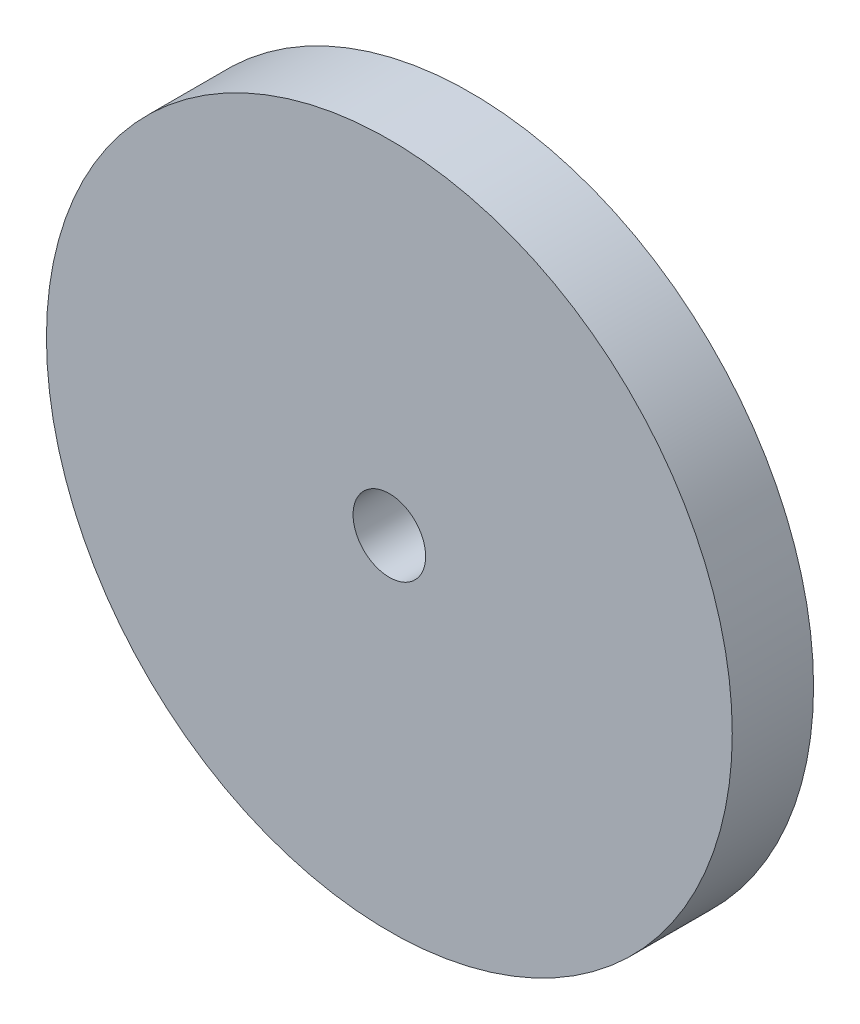
ISO-10303-21;
HEADER;
FILE_DESCRIPTION(('STEP AP214'),'2;1');
FILE_NAME('part.step','',(''),(''),'','','');
FILE_SCHEMA(('AUTOMOTIVE_DESIGN { 1 0 10303 214 1 1 1 1 }'));
ENDSEC;
DATA;
#1=APPLICATION_CONTEXT('core data for automotive mechanical design processes');
#2=APPLICATION_PROTOCOL_DEFINITION('international standard','automotive_design',2000,#1);
#3=PRODUCT_CONTEXT('',#1,'mechanical');
#4=PRODUCT('Part','Part','',(#3));
#5=PRODUCT_RELATED_PRODUCT_CATEGORY('part','',(#4));
#6=PRODUCT_DEFINITION_FORMATION('','',#4);
#7=PRODUCT_DEFINITION_CONTEXT('part definition',#1,'design');
#8=PRODUCT_DEFINITION('design','',#6,#7);
#9=PRODUCT_DEFINITION_SHAPE('','',#8);
#10=(LENGTH_UNIT() NAMED_UNIT(*) SI_UNIT(.MILLI.,.METRE.));
#11=(NAMED_UNIT(*) PLANE_ANGLE_UNIT() SI_UNIT($,.RADIAN.));
#12=(NAMED_UNIT(*) SI_UNIT($,.STERADIAN.) SOLID_ANGLE_UNIT());
#13=UNCERTAINTY_MEASURE_WITH_UNIT(LENGTH_MEASURE(1.E-05),#10,'distance_accuracy_value','');
#14=(GEOMETRIC_REPRESENTATION_CONTEXT(3) GLOBAL_UNCERTAINTY_ASSIGNED_CONTEXT((#13)) GLOBAL_UNIT_ASSIGNED_CONTEXT((#10,
#11,#12)) REPRESENTATION_CONTEXT('',''));
#15=CARTESIAN_POINT('',(0.,0.,0.));
#16=DIRECTION('',(0.,0.,1.));
#17=DIRECTION('',(1.,0.,0.));
#18=AXIS2_PLACEMENT_3D('',#15,#16,#17);
#19=CARTESIAN_POINT('',(0.,0.,3.556));
#20=DIRECTION('',(0.,0.,-1.));
#21=DIRECTION('',(-1.,0.,0.));
#22=AXIS2_PLACEMENT_3D('',#19,#20,#21);
#23=CYLINDRICAL_SURFACE('',#22,30.);
#24=CARTESIAN_POINT('',(0.,0.,3.556));
#25=DIRECTION('',(0.,0.,1.));
#26=DIRECTION('',(1.,0.,0.));
#27=AXIS2_PLACEMENT_3D('',#24,#25,#26);
#28=CIRCLE('',#27,30.);
#29=CARTESIAN_POINT('',(30.,0.,3.556));
#30=VERTEX_POINT('',#29);
#31=EDGE_CURVE('E10',#30,#30,#28,.T.);
#32=ORIENTED_EDGE('',*,*,#31,.F.);
#33=EDGE_LOOP('',(#32));
#34=FACE_BOUND('',#33,.T.);
#35=CARTESIAN_POINT('',(0.,0.,-3.556));
#36=DIRECTION('',(0.,0.,1.));
#37=DIRECTION('',(1.,0.,0.));
#38=AXIS2_PLACEMENT_3D('',#35,#36,#37);
#39=CIRCLE('',#38,30.);
#40=CARTESIAN_POINT('',(30.,0.,-3.556));
#41=VERTEX_POINT('',#40);
#42=EDGE_CURVE('E42',#41,#41,#39,.T.);
#43=ORIENTED_EDGE('',*,*,#42,.T.);
#44=EDGE_LOOP('',(#43));
#45=FACE_BOUND('',#44,.T.);
#46=ADVANCED_FACE('F39',(#34,#45),#23,.T.);
#47=CARTESIAN_POINT('',(0.,0.,3.556));
#48=DIRECTION('',(0.,0.,1.));
#49=DIRECTION('',(1.,0.,0.));
#50=AXIS2_PLACEMENT_3D('',#47,#48,#49);
#51=PLANE('',#50);
#52=CARTESIAN_POINT('',(0.,0.,3.556));
#53=DIRECTION('',(0.,0.,1.));
#54=DIRECTION('',(1.,0.,0.));
#55=AXIS2_PLACEMENT_3D('',#52,#53,#54);
#56=CIRCLE('',#55,3.175);
#57=CARTESIAN_POINT('',(3.175,0.,3.556));
#58=VERTEX_POINT('',#57);
#59=EDGE_CURVE('E56',#58,#58,#56,.T.);
#60=ORIENTED_EDGE('',*,*,#59,.F.);
#61=EDGE_LOOP('',(#60));
#62=FACE_BOUND('',#61,.T.);
#63=ORIENTED_EDGE('',*,*,#31,.T.);
#64=EDGE_LOOP('',(#63));
#65=FACE_BOUND('',#64,.T.);
#66=ADVANCED_FACE('F63',(#62,#65),#51,.T.);
#67=CARTESIAN_POINT('',(0.,0.,-3.556));
#68=DIRECTION('',(0.,0.,1.));
#69=DIRECTION('',(1.,0.,0.));
#70=AXIS2_PLACEMENT_3D('',#67,#68,#69);
#71=PLANE('',#70);
#72=CARTESIAN_POINT('',(0.,0.,-3.556));
#73=DIRECTION('',(0.,0.,1.));
#74=DIRECTION('',(1.,0.,0.));
#75=AXIS2_PLACEMENT_3D('',#72,#73,#74);
#76=CIRCLE('',#75,3.175);
#77=CARTESIAN_POINT('',(3.175,0.,-3.556));
#78=VERTEX_POINT('',#77);
#79=EDGE_CURVE('E51',#78,#78,#76,.T.);
#80=ORIENTED_EDGE('',*,*,#79,.T.);
#81=EDGE_LOOP('',(#80));
#82=FACE_BOUND('',#81,.T.);
#83=ORIENTED_EDGE('',*,*,#42,.F.);
#84=EDGE_LOOP('',(#83));
#85=FACE_BOUND('',#84,.T.);
#86=ADVANCED_FACE('F65',(#82,#85),#71,.F.);
#87=CARTESIAN_POINT('',(0.,0.,3.556));
#88=DIRECTION('',(0.,0.,1.));
#89=DIRECTION('',(1.,0.,0.));
#90=AXIS2_PLACEMENT_3D('',#87,#88,#89);
#91=CYLINDRICAL_SURFACE('',#90,3.175);
#92=ORIENTED_EDGE('',*,*,#79,.F.);
#93=EDGE_LOOP('',(#92));
#94=FACE_BOUND('',#93,.T.);
#95=ORIENTED_EDGE('',*,*,#59,.T.);
#96=EDGE_LOOP('',(#95));
#97=FACE_BOUND('',#96,.T.);
#98=ADVANCED_FACE('F61',(#94,#97),#91,.F.);
#99=CLOSED_SHELL('',(#46,#66,#86,#98));
#100=MANIFOLD_SOLID_BREP('B2',#99);
#101=ADVANCED_BREP_SHAPE_REPRESENTATION('',(#18,#100),#14);
#102=SHAPE_DEFINITION_REPRESENTATION(#9,#101);
ENDSEC;
END-ISO-10303-21;
